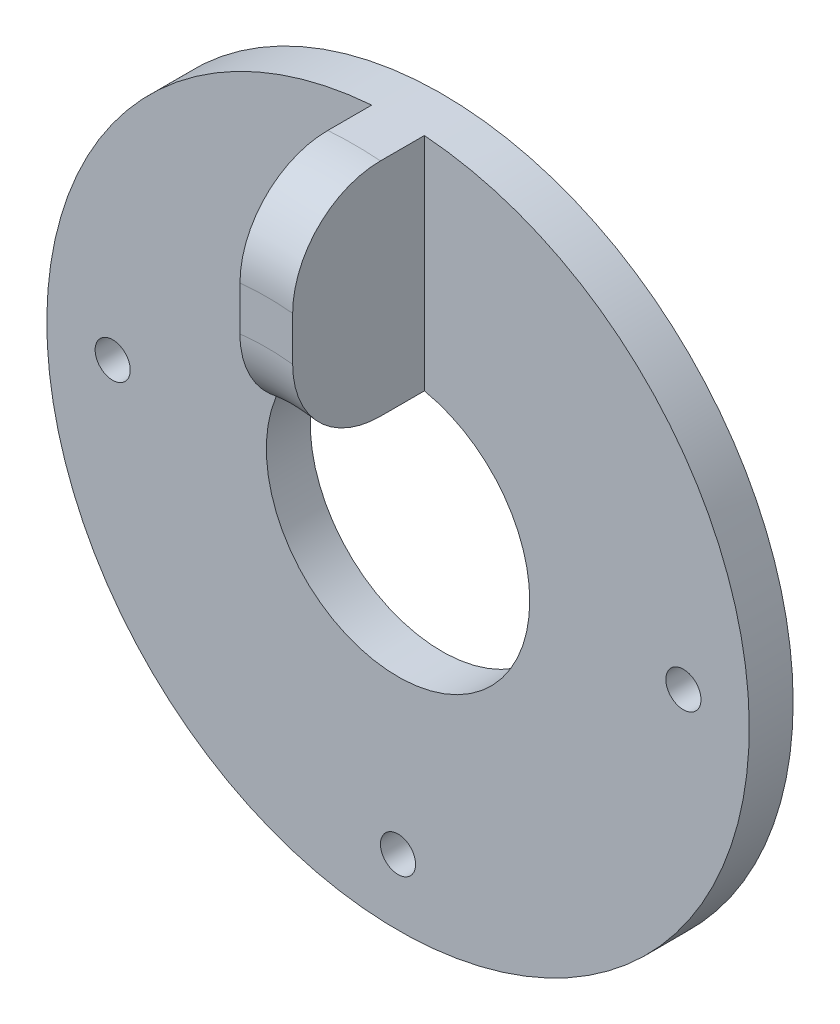
ISO-10303-21;
HEADER;
FILE_DESCRIPTION(('STEP AP214'),'2;1');
FILE_NAME('part.step','',(''),(''),'','','');
FILE_SCHEMA(('AUTOMOTIVE_DESIGN { 1 0 10303 214 1 1 1 1 }'));
ENDSEC;
DATA;
#1=APPLICATION_CONTEXT('core data for automotive mechanical design processes');
#2=APPLICATION_PROTOCOL_DEFINITION('international standard','automotive_design',2000,#1);
#3=PRODUCT_CONTEXT('',#1,'mechanical');
#4=PRODUCT('Part','Part','',(#3));
#5=PRODUCT_RELATED_PRODUCT_CATEGORY('part','',(#4));
#6=PRODUCT_DEFINITION_FORMATION('','',#4);
#7=PRODUCT_DEFINITION_CONTEXT('part definition',#1,'design');
#8=PRODUCT_DEFINITION('design','',#6,#7);
#9=PRODUCT_DEFINITION_SHAPE('','',#8);
#10=(LENGTH_UNIT() NAMED_UNIT(*) SI_UNIT(.MILLI.,.METRE.));
#11=(NAMED_UNIT(*) PLANE_ANGLE_UNIT() SI_UNIT($,.RADIAN.));
#12=(NAMED_UNIT(*) SI_UNIT($,.STERADIAN.) SOLID_ANGLE_UNIT());
#13=UNCERTAINTY_MEASURE_WITH_UNIT(LENGTH_MEASURE(1.E-05),#10,'distance_accuracy_value','');
#14=(GEOMETRIC_REPRESENTATION_CONTEXT(3) GLOBAL_UNCERTAINTY_ASSIGNED_CONTEXT((#13)) GLOBAL_UNIT_ASSIGNED_CONTEXT((#10,
#11,#12)) REPRESENTATION_CONTEXT('',''));
#15=CARTESIAN_POINT('',(0.,0.,0.));
#16=DIRECTION('',(0.,0.,1.));
#17=DIRECTION('',(1.,0.,0.));
#18=AXIS2_PLACEMENT_3D('',#15,#16,#17);
#19=CARTESIAN_POINT('',(0.,0.,5.));
#20=DIRECTION('',(0.,0.,-1.));
#21=DIRECTION('',(-1.,0.,0.));
#22=AXIS2_PLACEMENT_3D('',#19,#20,#21);
#23=CYLINDRICAL_SURFACE('',#22,40.);
#24=DIRECTION('',(0.,0.,-1.));
#25=VECTOR('',#24,1.);
#26=CARTESIAN_POINT('',(-3.,39.8873413503583,20.));
#27=LINE('',#26,#25);
#28=CARTESIAN_POINT('',(-3.,39.8873413503583,10.));
#29=VERTEX_POINT('',#28);
#30=CARTESIAN_POINT('',(-3.,39.8873413503583,5.));
#31=VERTEX_POINT('',#30);
#32=EDGE_CURVE('E106',#29,#31,#27,.T.);
#33=ORIENTED_EDGE('',*,*,#32,.F.);
#34=CARTESIAN_POINT('',(0.,0.,10.));
#35=DIRECTION('',(0.,0.,1.));
#36=DIRECTION('',(1.,0.,0.));
#37=AXIS2_PLACEMENT_3D('',#34,#35,#36);
#38=CIRCLE('',#37,40.);
#39=CARTESIAN_POINT('',(2.99999999999999,39.8873413503583,10.));
#40=VERTEX_POINT('',#39);
#41=EDGE_CURVE('E11',#29,#40,#38,.F.);
#42=ORIENTED_EDGE('',*,*,#41,.T.);
#43=DIRECTION('',(0.,0.,-1.));
#44=VECTOR('',#43,1.);
#45=CARTESIAN_POINT('',(2.99999999999999,39.8873413503583,20.));
#46=LINE('',#45,#44);
#47=CARTESIAN_POINT('',(2.99999999999999,39.8873413503583,5.));
#48=VERTEX_POINT('',#47);
#49=EDGE_CURVE('E133',#40,#48,#46,.T.);
#50=ORIENTED_EDGE('',*,*,#49,.T.);
#51=CARTESIAN_POINT('',(0.,0.,5.));
#52=DIRECTION('',(0.,0.,1.));
#53=DIRECTION('',(1.,0.,0.));
#54=AXIS2_PLACEMENT_3D('',#51,#52,#53);
#55=CIRCLE('',#54,40.);
#56=EDGE_CURVE('E153',#31,#48,#55,.T.);
#57=ORIENTED_EDGE('',*,*,#56,.F.);
#58=EDGE_LOOP('',(#33,#42,#50,#57));
#59=FACE_BOUND('',#58,.T.);
#60=CARTESIAN_POINT('',(0.,0.,0.));
#61=DIRECTION('',(0.,0.,1.));
#62=DIRECTION('',(1.,0.,0.));
#63=AXIS2_PLACEMENT_3D('',#60,#61,#62);
#64=CIRCLE('',#63,40.);
#65=CARTESIAN_POINT('',(40.,0.,0.));
#66=VERTEX_POINT('',#65);
#67=EDGE_CURVE('E157',#66,#66,#64,.T.);
#68=ORIENTED_EDGE('',*,*,#67,.T.);
#69=EDGE_LOOP('',(#68));
#70=FACE_BOUND('',#69,.T.);
#71=ADVANCED_FACE('F45',(#59,#70),#23,.T.);
#72=CARTESIAN_POINT('',(0.,0.,5.));
#73=DIRECTION('',(0.,0.,1.));
#74=DIRECTION('',(1.,0.,0.));
#75=AXIS2_PLACEMENT_3D('',#72,#73,#74);
#76=PLANE('',#75);
#77=DIRECTION('',(0.,1.,0.));
#78=VECTOR('',#77,1.);
#79=CARTESIAN_POINT('',(2.99999999999999,39.8873413503583,5.));
#80=LINE('',#79,#78);
#81=CARTESIAN_POINT('',(3.,14.6969384566991,5.));
#82=VERTEX_POINT('',#81);
#83=EDGE_CURVE('E118',#82,#48,#80,.T.);
#84=ORIENTED_EDGE('',*,*,#83,.F.);
#85=CARTESIAN_POINT('',(0.,0.,5.));
#86=DIRECTION('',(0.,0.,1.));
#87=DIRECTION('',(1.,0.,0.));
#88=AXIS2_PLACEMENT_3D('',#85,#86,#87);
#89=CIRCLE('',#88,15.);
#90=CARTESIAN_POINT('',(-3.,14.6969384566991,5.));
#91=VERTEX_POINT('',#90);
#92=EDGE_CURVE('E102',#91,#82,#89,.T.);
#93=ORIENTED_EDGE('',*,*,#92,.F.);
#94=DIRECTION('',(0.,-1.,0.));
#95=VECTOR('',#94,1.);
#96=CARTESIAN_POINT('',(-3.,39.8873413503583,5.));
#97=LINE('',#96,#95);
#98=EDGE_CURVE('E115',#31,#91,#97,.T.);
#99=ORIENTED_EDGE('',*,*,#98,.F.);
#100=ORIENTED_EDGE('',*,*,#56,.T.);
#101=EDGE_LOOP('',(#84,#93,#99,#100));
#102=FACE_BOUND('',#101,.T.);
#103=CARTESIAN_POINT('',(32.5,0.,5.));
#104=DIRECTION('',(0.,0.,1.));
#105=DIRECTION('',(1.,0.,0.));
#106=AXIS2_PLACEMENT_3D('',#103,#104,#105);
#107=CIRCLE('',#106,2.);
#108=CARTESIAN_POINT('',(34.5,0.,5.));
#109=VERTEX_POINT('',#108);
#110=EDGE_CURVE('E141',#109,#109,#107,.T.);
#111=ORIENTED_EDGE('',*,*,#110,.F.);
#112=EDGE_LOOP('',(#111));
#113=FACE_BOUND('',#112,.T.);
#114=CARTESIAN_POINT('',(0.,-32.5,5.));
#115=DIRECTION('',(0.,0.,1.));
#116=DIRECTION('',(1.,0.,0.));
#117=AXIS2_PLACEMENT_3D('',#114,#115,#116);
#118=CIRCLE('',#117,2.);
#119=CARTESIAN_POINT('',(2.,-32.5,5.));
#120=VERTEX_POINT('',#119);
#121=EDGE_CURVE('E146',#120,#120,#118,.T.);
#122=ORIENTED_EDGE('',*,*,#121,.F.);
#123=EDGE_LOOP('',(#122));
#124=FACE_BOUND('',#123,.T.);
#125=CARTESIAN_POINT('',(-32.5,0.,5.));
#126=DIRECTION('',(0.,0.,1.));
#127=DIRECTION('',(1.,0.,0.));
#128=AXIS2_PLACEMENT_3D('',#125,#126,#127);
#129=CIRCLE('',#128,2.);
#130=CARTESIAN_POINT('',(-30.5,0.,5.));
#131=VERTEX_POINT('',#130);
#132=EDGE_CURVE('E140',#131,#131,#129,.T.);
#133=ORIENTED_EDGE('',*,*,#132,.F.);
#134=EDGE_LOOP('',(#133));
#135=FACE_BOUND('',#134,.T.);
#136=ADVANCED_FACE('F112',(#102,#113,#124,#135),#76,.T.);
#137=CARTESIAN_POINT('',(0.,0.,0.));
#138=DIRECTION('',(0.,0.,1.));
#139=DIRECTION('',(1.,0.,0.));
#140=AXIS2_PLACEMENT_3D('',#137,#138,#139);
#141=PLANE('',#140);
#142=CARTESIAN_POINT('',(32.5,0.,0.));
#143=DIRECTION('',(0.,0.,1.));
#144=DIRECTION('',(1.,0.,0.));
#145=AXIS2_PLACEMENT_3D('',#142,#143,#144);
#146=CIRCLE('',#145,2.);
#147=CARTESIAN_POINT('',(34.5,0.,0.));
#148=VERTEX_POINT('',#147);
#149=EDGE_CURVE('E121',#148,#148,#146,.T.);
#150=ORIENTED_EDGE('',*,*,#149,.T.);
#151=EDGE_LOOP('',(#150));
#152=FACE_BOUND('',#151,.T.);
#153=CARTESIAN_POINT('',(0.,-32.5,0.));
#154=DIRECTION('',(0.,0.,1.));
#155=DIRECTION('',(1.,0.,0.));
#156=AXIS2_PLACEMENT_3D('',#153,#154,#155);
#157=CIRCLE('',#156,2.);
#158=CARTESIAN_POINT('',(2.,-32.5,0.));
#159=VERTEX_POINT('',#158);
#160=EDGE_CURVE('E167',#159,#159,#157,.T.);
#161=ORIENTED_EDGE('',*,*,#160,.T.);
#162=EDGE_LOOP('',(#161));
#163=FACE_BOUND('',#162,.T.);
#164=CARTESIAN_POINT('',(-32.5,0.,0.));
#165=DIRECTION('',(0.,0.,1.));
#166=DIRECTION('',(1.,0.,0.));
#167=AXIS2_PLACEMENT_3D('',#164,#165,#166);
#168=CIRCLE('',#167,2.);
#169=CARTESIAN_POINT('',(-30.5,0.,0.));
#170=VERTEX_POINT('',#169);
#171=EDGE_CURVE('E145',#170,#170,#168,.T.);
#172=ORIENTED_EDGE('',*,*,#171,.T.);
#173=EDGE_LOOP('',(#172));
#174=FACE_BOUND('',#173,.T.);
#175=CARTESIAN_POINT('',(0.,0.,0.));
#176=DIRECTION('',(0.,0.,1.));
#177=DIRECTION('',(1.,0.,0.));
#178=AXIS2_PLACEMENT_3D('',#175,#176,#177);
#179=CIRCLE('',#178,15.);
#180=CARTESIAN_POINT('',(15.,0.,0.));
#181=VERTEX_POINT('',#180);
#182=EDGE_CURVE('E120',#181,#181,#179,.T.);
#183=ORIENTED_EDGE('',*,*,#182,.T.);
#184=EDGE_LOOP('',(#183));
#185=FACE_BOUND('',#184,.T.);
#186=ORIENTED_EDGE('',*,*,#67,.F.);
#187=EDGE_LOOP('',(#186));
#188=FACE_BOUND('',#187,.T.);
#189=ADVANCED_FACE('F228',(#152,#163,#174,#185,#188),#141,.F.);
#190=CARTESIAN_POINT('',(0.,0.,-5.));
#191=DIRECTION('',(0.,0.,1.));
#192=DIRECTION('',(1.,0.,0.));
#193=AXIS2_PLACEMENT_3D('',#190,#191,#192);
#194=CYLINDRICAL_SURFACE('',#193,15.);
#195=DIRECTION('',(0.,0.,-1.));
#196=VECTOR('',#195,1.);
#197=CARTESIAN_POINT('',(3.,14.6969384566991,20.));
#198=LINE('',#197,#196);
#199=CARTESIAN_POINT('',(3.,14.6969384566991,10.));
#200=VERTEX_POINT('',#199);
#201=EDGE_CURVE('E107',#200,#82,#198,.T.);
#202=ORIENTED_EDGE('',*,*,#201,.F.);
#203=CARTESIAN_POINT('',(0.,0.,10.));
#204=DIRECTION('',(0.,0.,1.));
#205=DIRECTION('',(1.,0.,0.));
#206=AXIS2_PLACEMENT_3D('',#203,#204,#205);
#207=CIRCLE('',#206,15.);
#208=CARTESIAN_POINT('',(-3.,14.6969384566991,10.));
#209=VERTEX_POINT('',#208);
#210=EDGE_CURVE('E70',#200,#209,#207,.T.);
#211=ORIENTED_EDGE('',*,*,#210,.T.);
#212=DIRECTION('',(0.,0.,-1.));
#213=VECTOR('',#212,1.);
#214=CARTESIAN_POINT('',(-3.,14.6969384566991,20.));
#215=LINE('',#214,#213);
#216=EDGE_CURVE('E98',#209,#91,#215,.T.);
#217=ORIENTED_EDGE('',*,*,#216,.T.);
#218=ORIENTED_EDGE('',*,*,#92,.T.);
#219=EDGE_LOOP('',(#202,#211,#217,#218));
#220=FACE_BOUND('',#219,.T.);
#221=ORIENTED_EDGE('',*,*,#182,.F.);
#222=EDGE_LOOP('',(#221));
#223=FACE_BOUND('',#222,.T.);
#224=ADVANCED_FACE('F100',(#220,#223),#194,.F.);
#225=CARTESIAN_POINT('',(-32.5,0.,-5.));
#226=DIRECTION('',(0.,0.,1.));
#227=DIRECTION('',(1.,0.,0.));
#228=AXIS2_PLACEMENT_3D('',#225,#226,#227);
#229=CYLINDRICAL_SURFACE('',#228,2.);
#230=ORIENTED_EDGE('',*,*,#132,.T.);
#231=EDGE_LOOP('',(#230));
#232=FACE_BOUND('',#231,.T.);
#233=ORIENTED_EDGE('',*,*,#171,.F.);
#234=EDGE_LOOP('',(#233));
#235=FACE_BOUND('',#234,.T.);
#236=ADVANCED_FACE('F236',(#232,#235),#229,.F.);
#237=CARTESIAN_POINT('',(0.,-32.5,-5.));
#238=DIRECTION('',(0.,0.,1.));
#239=DIRECTION('',(1.,0.,0.));
#240=AXIS2_PLACEMENT_3D('',#237,#238,#239);
#241=CYLINDRICAL_SURFACE('',#240,2.);
#242=ORIENTED_EDGE('',*,*,#121,.T.);
#243=EDGE_LOOP('',(#242));
#244=FACE_BOUND('',#243,.T.);
#245=ORIENTED_EDGE('',*,*,#160,.F.);
#246=EDGE_LOOP('',(#245));
#247=FACE_BOUND('',#246,.T.);
#248=ADVANCED_FACE('F238',(#244,#247),#241,.F.);
#249=CARTESIAN_POINT('',(32.5,0.,-5.));
#250=DIRECTION('',(0.,0.,1.));
#251=DIRECTION('',(1.,0.,0.));
#252=AXIS2_PLACEMENT_3D('',#249,#250,#251);
#253=CYLINDRICAL_SURFACE('',#252,2.);
#254=ORIENTED_EDGE('',*,*,#110,.T.);
#255=EDGE_LOOP('',(#254));
#256=FACE_BOUND('',#255,.T.);
#257=ORIENTED_EDGE('',*,*,#149,.F.);
#258=EDGE_LOOP('',(#257));
#259=FACE_BOUND('',#258,.T.);
#260=ADVANCED_FACE('F206',(#256,#259),#253,.F.);
#261=CARTESIAN_POINT('',(-3.,39.8873413503583,20.));
#262=DIRECTION('',(1.,0.,0.));
#263=DIRECTION('',(0.,1.,0.));
#264=AXIS2_PLACEMENT_3D('',#261,#262,#263);
#265=PLANE('',#264);
#266=ORIENTED_EDGE('',*,*,#216,.F.);
#267=CARTESIAN_POINT('',(-3.,14.6969384566991,10.));
#268=CARTESIAN_POINT('',(-3.,14.6969022012917,10.2778561327571));
#269=CARTESIAN_POINT('',(-3.,14.7087563363784,10.5557043949549));
#270=CARTESIAN_POINT('',(-3.,14.755980855434,11.1093653432757));
#271=CARTESIAN_POINT('',(-3.,14.7913486211249,11.3851782525814));
#272=CARTESIAN_POINT('',(-3.,14.8852671546768,11.9324104034543));
#273=CARTESIAN_POINT('',(-3.,14.9437838945779,12.2038354880874));
#274=CARTESIAN_POINT('',(-3.,15.083496368782,12.7407822713512));
#275=CARTESIAN_POINT('',(-3.,15.1646921323601,13.0063039623609));
#276=CARTESIAN_POINT('',(-3.,15.3491096398285,13.5296231739638));
#277=CARTESIAN_POINT('',(-3.,15.4523344308812,13.7874196203317));
#278=CARTESIAN_POINT('',(-3.,15.6799788949757,14.2934838182728));
#279=CARTESIAN_POINT('',(-3.,15.8043991934686,14.5417512883936));
#280=CARTESIAN_POINT('',(-3.,16.0734708854297,15.0270777428171));
#281=CARTESIAN_POINT('',(-3.,16.2181229893728,15.2641363331092));
#282=CARTESIAN_POINT('',(-3.,16.5265647642338,15.7254550794068));
#283=CARTESIAN_POINT('',(-3.,16.6903545220947,15.9497151772614));
#284=CARTESIAN_POINT('',(-3.,17.0378285227181,16.3864166488663));
#285=CARTESIAN_POINT('',(-3.,17.2217168114759,16.5986956760538));
#286=CARTESIAN_POINT('',(-3.,17.6065608800439,17.0072997715706));
#287=CARTESIAN_POINT('',(-3.,17.807522183227,17.2036196363706));
#288=CARTESIAN_POINT('',(-3.,18.2250362123467,17.5789320114193));
#289=CARTESIAN_POINT('',(-3.,18.4415896376637,17.7579237435741));
#290=CARTESIAN_POINT('',(-3.,18.8887612441652,18.0973807369628));
#291=CARTESIAN_POINT('',(-3.,19.1193795917575,18.257845778935));
#292=CARTESIAN_POINT('',(-3.,19.5968302092933,18.561559844829));
#293=CARTESIAN_POINT('',(-3.,19.8438611045672,18.7044967549214));
#294=CARTESIAN_POINT('',(-3.,20.3489505299245,18.9691114258315));
#295=CARTESIAN_POINT('',(-3.,20.6070054471981,19.0907960859506));
#296=CARTESIAN_POINT('',(-3.,21.1323542981289,19.3120862254987));
#297=CARTESIAN_POINT('',(-3.,21.399645992472,19.4116970135874));
#298=CARTESIAN_POINT('',(-3.,21.9415320466057,19.5881434010352));
#299=CARTESIAN_POINT('',(-3.,22.2161247768677,19.6649840367633));
#300=CARTESIAN_POINT('',(-3.,22.8744775159241,19.8197093446195));
#301=CARTESIAN_POINT('',(-3.,23.2607381245638,19.8872838704268));
#302=CARTESIAN_POINT('',(-3.,23.8435315369533,19.9548839010648));
#303=CARTESIAN_POINT('',(-3.,24.0382687393009,19.971790257154));
#304=CARTESIAN_POINT('',(-3.,24.4284350327014,19.9943482783833));
#305=CARTESIAN_POINT('',(-3.,24.6238642607236,19.9999975744802));
#306=CARTESIAN_POINT('',(-3.,24.8193472919817,20.));
#307=B_SPLINE_CURVE_WITH_KNOTS('',3,(#267,#268,#269,#270,#271,#272,#273,#274,#275,#276,#277,
#278,#279,#280,#281,#282,#283,#284,#285,#286,#287,#288,#289,#290,#291,#292,#293,#294,#295,#296,
#297,#298,#299,#300,#301,#302,#303,#304,#305,#306),.UNSPECIFIED.,.F.,.F.,(4,2,2,2,2,2,2,2,2,2,2,
2,2,2,2,2,2,2,2,4),(0.,0.83330388026638,1.66651498643015,2.49850583353581,3.33049775461528,
4.16260483555189,4.99473647511065,5.82689734375473,6.65906199308202,7.50063794749928,
8.34248720860426,9.18437425418109,10.0262712623982,10.8814718393896,11.7363942670769,
12.5911108663658,13.4456382755783,14.6190381652176,15.2051753134329,15.7914358009216),.UNSPECIFIED.);
#308=CARTESIAN_POINT('',(-3.,24.8193472919817,20.));
#309=VERTEX_POINT('',#308);
#310=EDGE_CURVE('E55',#209,#309,#307,.T.);
#311=ORIENTED_EDGE('',*,*,#310,.T.);
#312=DIRECTION('',(0.,-1.,0.));
#313=VECTOR('',#312,1.);
#314=CARTESIAN_POINT('',(-3.,39.8873413503583,20.));
#315=LINE('',#314,#313);
#316=CARTESIAN_POINT('',(-3.,29.8496231131986,20.));
#317=VERTEX_POINT('',#316);
#318=EDGE_CURVE('E127',#317,#309,#315,.T.);
#319=ORIENTED_EDGE('',*,*,#318,.F.);
#320=CARTESIAN_POINT('',(-3.,29.8496231131986,20.));
#321=CARTESIAN_POINT('',(-3.,30.1328381180804,20.0000299828835));
#322=CARTESIAN_POINT('',(-3.,30.416050889579,19.9880899328147));
#323=CARTESIAN_POINT('',(-3.,30.9804653823213,19.9404647812326));
#324=CARTESIAN_POINT('',(-3.,31.2616671585772,19.9047803317966));
#325=CARTESIAN_POINT('',(-3.,31.8199031489942,19.8098895429215));
#326=CARTESIAN_POINT('',(-3.,32.096939737512,19.7506971760463));
#327=CARTESIAN_POINT('',(-3.,32.6450405299262,19.6091968734272));
#328=CARTESIAN_POINT('',(-3.,32.9161048382338,19.5268893421435));
#329=CARTESIAN_POINT('',(-3.,33.4504871607252,19.3396622357895));
#330=CARTESIAN_POINT('',(-3.,33.7138005613298,19.2347294909101));
#331=CARTESIAN_POINT('',(-3.,34.2306327018704,19.003004110668));
#332=CARTESIAN_POINT('',(-3.,34.4841512629083,18.8762110762683));
#333=CARTESIAN_POINT('',(-3.,34.9795067844305,18.6016832192899));
#334=CARTESIAN_POINT('',(-3.,35.2213464815268,18.4539533349081));
#335=CARTESIAN_POINT('',(-3.,35.6916625188126,18.138568140462));
#336=CARTESIAN_POINT('',(-3.,35.9201389689561,17.9709129943787));
#337=CARTESIAN_POINT('',(-3.,36.3614196779178,17.6173889759633));
#338=CARTESIAN_POINT('',(-3.,36.5742685768707,17.4315758236903));
#339=CARTESIAN_POINT('',(-3.,36.9835075519824,17.0426321601704));
#340=CARTESIAN_POINT('',(-3.,37.1798976852655,16.8395017090325));
#341=CARTESIAN_POINT('',(-3.,37.554840008106,16.4173193450029));
#342=CARTESIAN_POINT('',(-3.,37.7333884638173,16.1982641159287));
#343=CARTESIAN_POINT('',(-3.,38.0713046088257,15.7458334262177));
#344=CARTESIAN_POINT('',(-3.,38.2306726449678,15.5124582246482));
#345=CARTESIAN_POINT('',(-3.,38.5285781867096,15.033848723923));
#346=CARTESIAN_POINT('',(-3.,38.6671832475922,14.7886564741488));
#347=CARTESIAN_POINT('',(-3.,38.923191599042,14.2874508437309));
#348=CARTESIAN_POINT('',(-3.,39.0405953094437,14.0314376774896));
#349=CARTESIAN_POINT('',(-3.,39.25330332994,13.5105277442095));
#350=CARTESIAN_POINT('',(-3.,39.3486185963631,13.2456354563586));
#351=CARTESIAN_POINT('',(-3.,39.5165107255154,12.7088509925516));
#352=CARTESIAN_POINT('',(-3.,39.589093240947,12.4369605749695));
#353=CARTESIAN_POINT('',(-3.,39.7288842468277,11.8075378588443));
#354=CARTESIAN_POINT('',(-3.,39.7883043133189,11.4482274189307));
#355=CARTESIAN_POINT('',(-3.,39.8477198541101,10.9064555811279));
#356=CARTESIAN_POINT('',(-3.,39.8625725944102,10.7254914761343));
#357=CARTESIAN_POINT('',(-3.,39.8823822612233,10.3630326128513));
#358=CARTESIAN_POINT('',(-3.,39.8873397458559,10.1815378850688));
#359=CARTESIAN_POINT('',(-3.,39.8873413503583,10.));
#360=B_SPLINE_CURVE_WITH_KNOTS('',3,(#320,#321,#322,#323,#324,#325,#326,#327,#328,#329,#330,
#331,#332,#333,#334,#335,#336,#337,#338,#339,#340,#341,#342,#343,#344,#345,#346,#347,#348,#349,
#350,#351,#352,#353,#354,#355,#356,#357,#358,#359),.UNSPECIFIED.,.F.,.F.,(4,2,2,2,2,2,2,2,2,2,2,
2,2,2,2,2,2,2,2,4),(0.,0.849390433924776,1.69875754254533,2.54762056070723,3.39646872671948,
4.24581233531233,5.09517144943482,5.94433056481187,6.79348269226003,7.64010636575473,
8.48672710070255,9.33352464413208,10.1803068723814,11.0242711648038,11.868218742994,
12.7117468052825,13.5550649499221,14.6451705801299,15.1896611500758,15.734121008393),.UNSPECIFIED.);
#361=EDGE_CURVE('E62',#317,#29,#360,.T.);
#362=ORIENTED_EDGE('',*,*,#361,.T.);
#363=ORIENTED_EDGE('',*,*,#32,.T.);
#364=ORIENTED_EDGE('',*,*,#98,.T.);
#365=EDGE_LOOP('',(#266,#311,#319,#362,#363,#364));
#366=FACE_BOUND('',#365,.T.);
#367=ADVANCED_FACE('F123',(#366),#265,.F.);
#368=CARTESIAN_POINT('',(2.99999999999999,39.8873413503583,20.));
#369=DIRECTION('',(-1.,0.,0.));
#370=DIRECTION('',(0.,-1.,0.));
#371=AXIS2_PLACEMENT_3D('',#368,#369,#370);
#372=PLANE('',#371);
#373=DIRECTION('',(0.,1.,0.));
#374=VECTOR('',#373,1.);
#375=CARTESIAN_POINT('',(2.99999999999999,39.8873413503583,20.));
#376=LINE('',#375,#374);
#377=CARTESIAN_POINT('',(3.,24.8193472919817,20.));
#378=VERTEX_POINT('',#377);
#379=CARTESIAN_POINT('',(3.,29.8496231131986,20.));
#380=VERTEX_POINT('',#379);
#381=EDGE_CURVE('E130',#378,#380,#376,.T.);
#382=ORIENTED_EDGE('',*,*,#381,.F.);
#383=CARTESIAN_POINT('',(3.,24.8193472919817,20.));
#384=CARTESIAN_POINT('',(3.,24.5330607493907,20.0000300684409));
#385=CARTESIAN_POINT('',(3.,24.2467816442852,19.9878843315606));
#386=CARTESIAN_POINT('',(3.,23.6762857678342,19.9394963941136));
#387=CARTESIAN_POINT('',(3.,23.3920688566166,19.903255843563));
#388=CARTESIAN_POINT('',(3.,22.827925229804,19.8069709367355));
#389=CARTESIAN_POINT('',(3.,22.5479953399228,19.746945174755));
#390=CARTESIAN_POINT('',(3.,21.9941823636157,19.6035493965086));
#391=CARTESIAN_POINT('',(3.,21.7202992437073,19.5201795095399));
#392=CARTESIAN_POINT('',(3.,21.1804146033566,19.3306636747192));
#393=CARTESIAN_POINT('',(3.,20.9144160752986,19.2245092024282));
#394=CARTESIAN_POINT('',(3.,20.3922858874217,18.9901983596937));
#395=CARTESIAN_POINT('',(3.,20.136154439237,18.8620415176537));
#396=CARTESIAN_POINT('',(3.,19.6356162548907,18.5846469416411));
#397=CARTESIAN_POINT('',(3.,19.3912080062338,18.435411936969));
#398=CARTESIAN_POINT('',(3.,18.9158285552703,18.1168886174611));
#399=CARTESIAN_POINT('',(3.,18.6848572940179,17.9476003906056));
#400=CARTESIAN_POINT('',(3.,18.2378060874567,17.5899720243511));
#401=CARTESIAN_POINT('',(3.,18.0217404739173,17.4016139670484));
#402=CARTESIAN_POINT('',(3.,17.606328959596,17.0072845176728));
#403=CARTESIAN_POINT('',(3.,17.4069829370763,16.8013132538663));
#404=CARTESIAN_POINT('',(3.,17.0264607359345,16.3731390786988));
#405=CARTESIAN_POINT('',(3.,16.845288391006,16.1509327596068));
#406=CARTESIAN_POINT('',(3.,16.5025548872651,15.6918828652167));
#407=CARTESIAN_POINT('',(3.,16.3409932328389,15.4550396600598));
#408=CARTESIAN_POINT('',(3.,16.0399021490582,14.9702357270768));
#409=CARTESIAN_POINT('',(3.,15.9002143147308,14.7223733919884));
#410=CARTESIAN_POINT('',(3.,15.6425253494879,14.2156300247751));
#411=CARTESIAN_POINT('',(3.,15.524523438067,13.9567493896267));
#412=CARTESIAN_POINT('',(3.,15.3112496189966,13.4299860524678));
#413=CARTESIAN_POINT('',(3.,15.2159619628166,13.1621097353315));
#414=CARTESIAN_POINT('',(3.,15.0488487214892,12.6192514482839));
#415=CARTESIAN_POINT('',(3.,14.9770163578118,12.3442715561251));
#416=CARTESIAN_POINT('',(3.,14.8440721066035,11.7271702858468));
#417=CARTESIAN_POINT('',(3.,14.7889109108311,11.3837351064414));
#418=CARTESIAN_POINT('',(3.,14.7337402743873,10.8660358335995));
#419=CARTESIAN_POINT('',(3.,14.7199452715354,10.6931264140944));
#420=CARTESIAN_POINT('',(3.,14.7015447504254,10.3468239320922));
#421=CARTESIAN_POINT('',(3.,14.6969389868988,10.1734308826274));
#422=CARTESIAN_POINT('',(3.,14.6969384566991,10.));
#423=B_SPLINE_CURVE_WITH_KNOTS('',3,(#383,#384,#385,#386,#387,#388,#389,#390,#391,#392,#393,
#394,#395,#396,#397,#398,#399,#400,#401,#402,#403,#404,#405,#406,#407,#408,#409,#410,#411,#412,
#413,#414,#415,#416,#417,#418,#419,#420,#421,#422),.UNSPECIFIED.,.F.,.F.,(4,2,2,2,2,2,2,2,2,2,2,
2,2,2,2,2,2,2,2,4),(0.,0.858591493910588,1.71712419741307,2.57498705544751,3.4328451620925,
4.29102478197944,5.14922279829569,6.00730979275672,6.86539302263951,7.72429011996289,
8.58318096297946,9.442252607613,10.3013025367169,11.1538108773016,12.006288528954,
12.8581733997778,13.7098118593285,14.7511240565307,15.2712940661228,15.7914501917552),.UNSPECIFIED.);
#424=EDGE_CURVE('E189',#378,#200,#423,.T.);
#425=ORIENTED_EDGE('',*,*,#424,.T.);
#426=ORIENTED_EDGE('',*,*,#201,.T.);
#427=ORIENTED_EDGE('',*,*,#83,.T.);
#428=ORIENTED_EDGE('',*,*,#49,.F.);
#429=CARTESIAN_POINT('',(2.99999999999999,39.8873413503583,10.));
#430=CARTESIAN_POINT('',(2.99999999999999,39.8873719539445,10.2806397649112));
#431=CARTESIAN_POINT('',(2.99999999999999,39.8754954707854,10.5612749698186));
#432=CARTESIAN_POINT('',(2.99999999999999,39.8281494915406,11.1205340221599));
#433=CARTESIAN_POINT('',(2.99999999999999,39.7926812293425,11.3991579740152));
#434=CARTESIAN_POINT('',(2.99999999999999,39.6984115867384,11.9521945651234));
#435=CARTESIAN_POINT('',(2.99999999999999,39.6396294181878,12.2266104791079));
#436=CARTESIAN_POINT('',(2.99999999999999,39.4991650564407,12.7695136582185));
#437=CARTESIAN_POINT('',(2.99999999999999,39.4174831246391,13.0380009909801));
#438=CARTESIAN_POINT('',(2.99999999999999,39.2317616200714,13.5672648541658));
#439=CARTESIAN_POINT('',(2.99999999999999,39.127711935474,13.8280378362926));
#440=CARTESIAN_POINT('',(2.99999999999999,38.8980230587944,14.3399024217763));
#441=CARTESIAN_POINT('',(2.99999999999999,38.7723833843933,14.5909938086934));
#442=CARTESIAN_POINT('',(2.99999999999999,38.5004411814506,15.081670336777));
#443=CARTESIAN_POINT('',(2.99999999999999,38.354142141309,15.3212574113499));
#444=CARTESIAN_POINT('',(2.99999999999999,38.0419147821911,15.7872781429329));
#445=CARTESIAN_POINT('',(2.99999999999999,37.8759865499665,16.013711858068));
#446=CARTESIAN_POINT('',(2.99999999999999,37.5255074459582,16.4520582827872));
#447=CARTESIAN_POINT('',(2.99999999999999,37.3409376186872,16.6639558363363));
#448=CARTESIAN_POINT('',(2.99999999999999,36.9546379630868,17.0714849373032));
#449=CARTESIAN_POINT('',(2.99999999999999,36.7529080925634,17.2671164447228));
#450=CARTESIAN_POINT('',(2.99999999999999,36.3336882683129,17.6407791388141));
#451=CARTESIAN_POINT('',(2.99999999999999,36.1161952665205,17.818806905688));
#452=CARTESIAN_POINT('',(2.99999999999999,35.6670369178077,18.1559750382167));
#453=CARTESIAN_POINT('',(2.99999999999999,35.4353717529104,18.3151156463756));
#454=CARTESIAN_POINT('',(2.99999999999999,34.9588203215837,18.6138415959739));
#455=CARTESIAN_POINT('',(3.,34.7138976371171,18.7533688454084));
#456=CARTESIAN_POINT('',(3.,34.213201068434,19.0113497071214));
#457=CARTESIAN_POINT('',(3.,33.9574272786156,19.1298035026798));
#458=CARTESIAN_POINT('',(3.,33.4369331006567,19.3447827436754));
#459=CARTESIAN_POINT('',(3.,33.1722163117161,19.4413168929123));
#460=CARTESIAN_POINT('',(3.,32.6357268511405,19.6118364320669));
#461=CARTESIAN_POINT('',(3.,32.3639558099986,19.6858269831404));
#462=CARTESIAN_POINT('',(3.,31.7221962525081,19.831943419556));
#463=CARTESIAN_POINT('',(3.,31.3500752981421,19.8949758453909));
#464=CARTESIAN_POINT('',(3.,30.7888667750417,19.9579878162047));
#465=CARTESIAN_POINT('',(3.,30.6014026745642,19.9737356857775));
#466=CARTESIAN_POINT('',(3.,30.2258493259887,19.9947418045075));
#467=CARTESIAN_POINT('',(3.,30.037759958589,19.9999979212923));
#468=CARTESIAN_POINT('',(3.,29.8496231131986,20.));
#469=B_SPLINE_CURVE_WITH_KNOTS('',3,(#429,#430,#431,#432,#433,#434,#435,#436,#437,#438,#439,
#440,#441,#442,#443,#444,#445,#446,#447,#448,#449,#450,#451,#452,#453,#454,#455,#456,#457,#458,
#459,#460,#461,#462,#463,#464,#465,#466,#467,#468),.UNSPECIFIED.,.F.,.F.,(4,2,2,2,2,2,2,2,2,2,2,
2,2,2,2,2,2,2,2,4),(0.,0.84166163219806,1.68327924761186,2.52420476310337,3.36512068004181,
4.206417553849,5.04773322460874,5.88890700600771,6.73007706995307,7.57211124771875,
8.41414749598348,9.25634700270644,10.0985356947326,10.9431685171126,11.7877939931978,
12.6320834986707,13.4761795660933,14.6057464285077,15.1698739569157,15.7341161284652),.UNSPECIFIED.);
#470=EDGE_CURVE('E181',#40,#380,#469,.T.);
#471=ORIENTED_EDGE('',*,*,#470,.T.);
#472=EDGE_LOOP('',(#382,#425,#426,#427,#428,#471));
#473=FACE_BOUND('',#472,.T.);
#474=ADVANCED_FACE('F195',(#473),#372,.F.);
#475=CARTESIAN_POINT('',(0.,0.,20.));
#476=DIRECTION('',(0.,0.,1.));
#477=DIRECTION('',(1.,0.,0.));
#478=AXIS2_PLACEMENT_3D('',#475,#476,#477);
#479=PLANE('',#478);
#480=ORIENTED_EDGE('',*,*,#318,.T.);
#481=CARTESIAN_POINT('',(0.,0.,20.));
#482=DIRECTION('',(0.,0.,1.));
#483=DIRECTION('',(1.,0.,0.));
#484=AXIS2_PLACEMENT_3D('',#481,#482,#483);
#485=CIRCLE('',#484,25.);
#486=EDGE_CURVE('E177',#309,#378,#485,.F.);
#487=ORIENTED_EDGE('',*,*,#486,.T.);
#488=ORIENTED_EDGE('',*,*,#381,.T.);
#489=CARTESIAN_POINT('',(0.,0.,20.));
#490=DIRECTION('',(0.,0.,1.));
#491=DIRECTION('',(1.,0.,0.));
#492=AXIS2_PLACEMENT_3D('',#489,#490,#491);
#493=CIRCLE('',#492,30.);
#494=EDGE_CURVE('E156',#380,#317,#493,.T.);
#495=ORIENTED_EDGE('',*,*,#494,.T.);
#496=EDGE_LOOP('',(#480,#487,#488,#495));
#497=FACE_BOUND('',#496,.T.);
#498=ADVANCED_FACE('F200',(#497),#479,.T.);
#499=CARTESIAN_POINT('',(0.,0.,10.));
#500=DIRECTION('',(0.,0.,1.));
#501=DIRECTION('',(1.,0.,0.));
#502=AXIS2_PLACEMENT_3D('',#499,#500,#501);
#503=TOROIDAL_SURFACE('',#502,25.,10.);
#504=ORIENTED_EDGE('',*,*,#310,.F.);
#505=ORIENTED_EDGE('',*,*,#210,.F.);
#506=ORIENTED_EDGE('',*,*,#424,.F.);
#507=ORIENTED_EDGE('',*,*,#486,.F.);
#508=EDGE_LOOP('',(#504,#505,#506,#507));
#509=FACE_BOUND('',#508,.T.);
#510=ADVANCED_FACE('F219',(#509),#503,.T.);
#511=CARTESIAN_POINT('',(0.,0.,10.));
#512=DIRECTION('',(0.,0.,1.));
#513=DIRECTION('',(1.,0.,0.));
#514=AXIS2_PLACEMENT_3D('',#511,#512,#513);
#515=TOROIDAL_SURFACE('',#514,30.,10.);
#516=ORIENTED_EDGE('',*,*,#470,.F.);
#517=ORIENTED_EDGE('',*,*,#41,.F.);
#518=ORIENTED_EDGE('',*,*,#361,.F.);
#519=ORIENTED_EDGE('',*,*,#494,.F.);
#520=EDGE_LOOP('',(#516,#517,#518,#519));
#521=FACE_BOUND('',#520,.T.);
#522=ADVANCED_FACE('F47',(#521),#515,.T.);
#523=CLOSED_SHELL('',(#71,#136,#189,#224,#236,#248,#260,#367,#474,#498,#510,#522));
#524=MANIFOLD_SOLID_BREP('B2',#523);
#525=ADVANCED_BREP_SHAPE_REPRESENTATION('',(#18,#524),#14);
#526=SHAPE_DEFINITION_REPRESENTATION(#9,#525);
ENDSEC;
END-ISO-10303-21;
